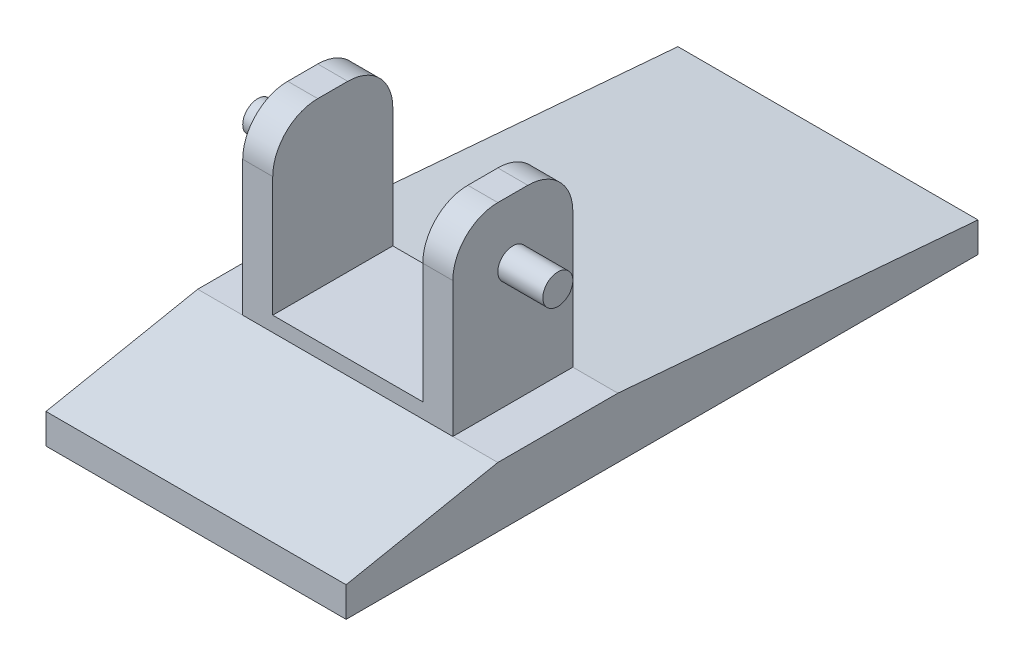
ISO-10303-21;
HEADER;
FILE_DESCRIPTION(('STEP AP214'),'2;1');
FILE_NAME('part.step','',(''),(''),'','','');
FILE_SCHEMA(('AUTOMOTIVE_DESIGN { 1 0 10303 214 1 1 1 1 }'));
ENDSEC;
DATA;
#1=APPLICATION_CONTEXT('core data for automotive mechanical design processes');
#2=APPLICATION_PROTOCOL_DEFINITION('international standard','automotive_design',2000,#1);
#3=PRODUCT_CONTEXT('',#1,'mechanical');
#4=PRODUCT('Part','Part','',(#3));
#5=PRODUCT_RELATED_PRODUCT_CATEGORY('part','',(#4));
#6=PRODUCT_DEFINITION_FORMATION('','',#4);
#7=PRODUCT_DEFINITION_CONTEXT('part definition',#1,'design');
#8=PRODUCT_DEFINITION('design','',#6,#7);
#9=PRODUCT_DEFINITION_SHAPE('','',#8);
#10=(LENGTH_UNIT() NAMED_UNIT(*) SI_UNIT(.MILLI.,.METRE.));
#11=(NAMED_UNIT(*) PLANE_ANGLE_UNIT() SI_UNIT($,.RADIAN.));
#12=(NAMED_UNIT(*) SI_UNIT($,.STERADIAN.) SOLID_ANGLE_UNIT());
#13=UNCERTAINTY_MEASURE_WITH_UNIT(LENGTH_MEASURE(1.E-05),#10,'distance_accuracy_value','');
#14=(GEOMETRIC_REPRESENTATION_CONTEXT(3) GLOBAL_UNCERTAINTY_ASSIGNED_CONTEXT((#13)) GLOBAL_UNIT_ASSIGNED_CONTEXT((#10,
#11,#12)) REPRESENTATION_CONTEXT('',''));
#15=CARTESIAN_POINT('',(0.,0.,0.));
#16=DIRECTION('',(0.,0.,1.));
#17=DIRECTION('',(1.,0.,0.));
#18=AXIS2_PLACEMENT_3D('',#15,#16,#17);
#19=CARTESIAN_POINT('',(10.,46.1253104324718,-4.99999999999999));
#20=DIRECTION('',(-1.,0.,0.));
#21=DIRECTION('',(0.,0.,1.));
#22=AXIS2_PLACEMENT_3D('',#19,#20,#21);
#23=PLANE('',#22);
#24=CARTESIAN_POINT('',(10.,41.1253104324718,0.));
#25=DIRECTION('',(-1.,0.,0.));
#26=DIRECTION('',(0.,0.,1.));
#27=AXIS2_PLACEMENT_3D('',#24,#25,#26);
#28=CIRCLE('',#27,5.);
#29=CARTESIAN_POINT('',(10.,41.1253104324718,5.));
#30=VERTEX_POINT('',#29);
#31=EDGE_CURVE('E11',#30,#30,#28,.F.);
#32=ORIENTED_EDGE('',*,*,#31,.F.);
#33=EDGE_LOOP('',(#32));
#34=FACE_BOUND('',#33,.T.);
#35=DIRECTION('',(0.,0.,1.));
#36=VECTOR('',#35,1.);
#37=CARTESIAN_POINT('',(10.,1.1253104324718,20.));
#38=LINE('',#37,#36);
#39=CARTESIAN_POINT('',(10.,1.1253104324718,-20.));
#40=VERTEX_POINT('',#39);
#41=CARTESIAN_POINT('',(10.,1.1253104324718,20.));
#42=VERTEX_POINT('',#41);
#43=EDGE_CURVE('E86',#40,#42,#38,.T.);
#44=ORIENTED_EDGE('',*,*,#43,.F.);
#45=DIRECTION('',(0.,1.,0.));
#46=VECTOR('',#45,1.);
#47=CARTESIAN_POINT('',(10.,46.1253104324718,-20.));
#48=LINE('',#47,#46);
#49=CARTESIAN_POINT('',(10.,46.1253104324718,-20.));
#50=VERTEX_POINT('',#49);
#51=EDGE_CURVE('E128',#40,#50,#48,.T.);
#52=ORIENTED_EDGE('',*,*,#51,.T.);
#53=CARTESIAN_POINT('',(10.,46.1253104324718,-4.99999999999999));
#54=DIRECTION('',(1.,0.,0.));
#55=DIRECTION('',(0.,0.,1.));
#56=AXIS2_PLACEMENT_3D('',#53,#54,#55);
#57=CIRCLE('',#56,15.);
#58=CARTESIAN_POINT('',(10.,61.1253104324718,-4.99999999999999));
#59=VERTEX_POINT('',#58);
#60=EDGE_CURVE('E101',#50,#59,#57,.T.);
#61=ORIENTED_EDGE('',*,*,#60,.T.);
#62=DIRECTION('',(0.,0.,1.));
#63=VECTOR('',#62,1.);
#64=CARTESIAN_POINT('',(10.,61.1253104324718,5.));
#65=LINE('',#64,#63);
#66=CARTESIAN_POINT('',(10.,61.1253104324718,5.));
#67=VERTEX_POINT('',#66);
#68=EDGE_CURVE('E96',#59,#67,#65,.T.);
#69=ORIENTED_EDGE('',*,*,#68,.T.);
#70=CARTESIAN_POINT('',(10.,46.1253104324718,5.));
#71=DIRECTION('',(1.,0.,0.));
#72=DIRECTION('',(0.,0.,-1.));
#73=AXIS2_PLACEMENT_3D('',#70,#71,#72);
#74=CIRCLE('',#73,15.);
#75=CARTESIAN_POINT('',(10.,46.1253104324718,20.));
#76=VERTEX_POINT('',#75);
#77=EDGE_CURVE('E99',#67,#76,#74,.T.);
#78=ORIENTED_EDGE('',*,*,#77,.T.);
#79=DIRECTION('',(0.,-1.,0.));
#80=VECTOR('',#79,1.);
#81=CARTESIAN_POINT('',(10.,46.1253104324718,20.));
#82=LINE('',#81,#80);
#83=EDGE_CURVE('E58',#76,#42,#82,.T.);
#84=ORIENTED_EDGE('',*,*,#83,.T.);
#85=EDGE_LOOP('',(#44,#52,#61,#69,#78,#84));
#86=FACE_BOUND('',#85,.T.);
#87=ADVANCED_FACE('F34',(#34,#86),#23,.F.);
#88=CARTESIAN_POINT('',(10.,-8.8746895675282,70.5497856889293));
#89=DIRECTION('',(0.,0.,-1.));
#90=DIRECTION('',(-1.,0.,0.));
#91=AXIS2_PLACEMENT_3D('',#88,#89,#90);
#92=PLANE('',#91);
#93=DIRECTION('',(-1.,0.,0.));
#94=VECTOR('',#93,1.);
#95=CARTESIAN_POINT('',(10.,-8.8746895675282,70.5497856889293));
#96=LINE('',#95,#94);
#97=CARTESIAN_POINT('',(25.,-8.8746895675282,70.5497856889293));
#98=VERTEX_POINT('',#97);
#99=CARTESIAN_POINT('',(-75.,-8.8746895675282,70.5497856889293));
#100=VERTEX_POINT('',#99);
#101=EDGE_CURVE('E115',#98,#100,#96,.T.);
#102=ORIENTED_EDGE('',*,*,#101,.T.);
#103=DIRECTION('',(0.,-1.,0.));
#104=VECTOR('',#103,1.);
#105=CARTESIAN_POINT('',(-75.,-18.8746895675282,70.5497856889293));
#106=LINE('',#105,#104);
#107=CARTESIAN_POINT('',(-75.,-18.8746895675282,70.5497856889293));
#108=VERTEX_POINT('',#107);
#109=EDGE_CURVE('E172',#100,#108,#106,.T.);
#110=ORIENTED_EDGE('',*,*,#109,.T.);
#111=DIRECTION('',(-1.,0.,0.));
#112=VECTOR('',#111,1.);
#113=CARTESIAN_POINT('',(10.,-18.8746895675282,70.5497856889293));
#114=LINE('',#113,#112);
#115=CARTESIAN_POINT('',(25.,-18.8746895675282,70.5497856889293));
#116=VERTEX_POINT('',#115);
#117=EDGE_CURVE('E42',#116,#108,#114,.T.);
#118=ORIENTED_EDGE('',*,*,#117,.F.);
#119=DIRECTION('',(0.,-1.,0.));
#120=VECTOR('',#119,1.);
#121=CARTESIAN_POINT('',(25.,-18.8746895675282,70.5497856889293));
#122=LINE('',#121,#120);
#123=EDGE_CURVE('E250',#98,#116,#122,.T.);
#124=ORIENTED_EDGE('',*,*,#123,.F.);
#125=EDGE_LOOP('',(#102,#110,#118,#124));
#126=FACE_BOUND('',#125,.T.);
#127=ADVANCED_FACE('F36',(#126),#92,.F.);
#128=CARTESIAN_POINT('',(10.,-18.8746895675282,70.5497856889293));
#129=DIRECTION('',(0.,1.,0.));
#130=DIRECTION('',(0.,0.,1.));
#131=AXIS2_PLACEMENT_3D('',#128,#129,#130);
#132=PLANE('',#131);
#133=ORIENTED_EDGE('',*,*,#117,.T.);
#134=DIRECTION('',(0.,0.,-1.));
#135=VECTOR('',#134,1.);
#136=CARTESIAN_POINT('',(-75.,-18.8746895675282,-140.));
#137=LINE('',#136,#135);
#138=CARTESIAN_POINT('',(-75.,-18.8746895675282,-140.));
#139=VERTEX_POINT('',#138);
#140=EDGE_CURVE('E157',#108,#139,#137,.T.);
#141=ORIENTED_EDGE('',*,*,#140,.T.);
#142=DIRECTION('',(-1.,0.,0.));
#143=VECTOR('',#142,1.);
#144=CARTESIAN_POINT('',(10.,-18.8746895675282,-140.));
#145=LINE('',#144,#143);
#146=CARTESIAN_POINT('',(25.,-18.8746895675282,-140.));
#147=VERTEX_POINT('',#146);
#148=EDGE_CURVE('E145',#147,#139,#145,.T.);
#149=ORIENTED_EDGE('',*,*,#148,.F.);
#150=DIRECTION('',(0.,0.,-1.));
#151=VECTOR('',#150,1.);
#152=CARTESIAN_POINT('',(25.,-18.8746895675282,-140.));
#153=LINE('',#152,#151);
#154=EDGE_CURVE('E160',#116,#147,#153,.T.);
#155=ORIENTED_EDGE('',*,*,#154,.F.);
#156=EDGE_LOOP('',(#133,#141,#149,#155));
#157=FACE_BOUND('',#156,.T.);
#158=ADVANCED_FACE('F154',(#157),#132,.F.);
#159=CARTESIAN_POINT('',(10.,-8.8746895675282,-140.));
#160=DIRECTION('',(0.,0.,1.));
#161=DIRECTION('',(1.,0.,0.));
#162=AXIS2_PLACEMENT_3D('',#159,#160,#161);
#163=PLANE('',#162);
#164=ORIENTED_EDGE('',*,*,#148,.T.);
#165=DIRECTION('',(0.,1.,0.));
#166=VECTOR('',#165,1.);
#167=CARTESIAN_POINT('',(-75.,-8.8746895675282,-140.));
#168=LINE('',#167,#166);
#169=CARTESIAN_POINT('',(-75.,-8.8746895675282,-140.));
#170=VERTEX_POINT('',#169);
#171=EDGE_CURVE('E175',#139,#170,#168,.T.);
#172=ORIENTED_EDGE('',*,*,#171,.T.);
#173=DIRECTION('',(-1.,0.,0.));
#174=VECTOR('',#173,1.);
#175=CARTESIAN_POINT('',(10.,-8.8746895675282,-140.));
#176=LINE('',#175,#174);
#177=CARTESIAN_POINT('',(25.,-8.8746895675282,-140.));
#178=VERTEX_POINT('',#177);
#179=EDGE_CURVE('E142',#178,#170,#176,.T.);
#180=ORIENTED_EDGE('',*,*,#179,.F.);
#181=DIRECTION('',(0.,1.,0.));
#182=VECTOR('',#181,1.);
#183=CARTESIAN_POINT('',(25.,-8.8746895675282,-140.));
#184=LINE('',#183,#182);
#185=EDGE_CURVE('E253',#147,#178,#184,.T.);
#186=ORIENTED_EDGE('',*,*,#185,.F.);
#187=EDGE_LOOP('',(#164,#172,#180,#186));
#188=FACE_BOUND('',#187,.T.);
#189=ADVANCED_FACE('F384',(#188),#163,.F.);
#190=CARTESIAN_POINT('',(10.,1.1253104324718,-20.));
#191=DIRECTION('',(0.,-0.99654575824488,0.08304547985374));
#192=DIRECTION('',(0.,-0.08304547985374,-0.99654575824488));
#193=AXIS2_PLACEMENT_3D('',#190,#191,#192);
#194=PLANE('',#193);
#195=ORIENTED_EDGE('',*,*,#179,.T.);
#196=DIRECTION('',(0.,0.08304547985374,0.99654575824488));
#197=VECTOR('',#196,1.);
#198=CARTESIAN_POINT('',(-75.,1.1253104324718,-20.));
#199=LINE('',#198,#197);
#200=CARTESIAN_POINT('',(-75.,1.1253104324718,-20.));
#201=VERTEX_POINT('',#200);
#202=EDGE_CURVE('E185',#170,#201,#199,.T.);
#203=ORIENTED_EDGE('',*,*,#202,.T.);
#204=DIRECTION('',(1.,0.,0.));
#205=VECTOR('',#204,1.);
#206=CARTESIAN_POINT('',(-75.,1.1253104324718,-20.));
#207=LINE('',#206,#205);
#208=CARTESIAN_POINT('',(-60.,1.1253104324718,-20.));
#209=VERTEX_POINT('',#208);
#210=EDGE_CURVE('E196',#201,#209,#207,.T.);
#211=ORIENTED_EDGE('',*,*,#210,.T.);
#212=DIRECTION('',(-1.,0.,0.));
#213=VECTOR('',#212,1.);
#214=CARTESIAN_POINT('',(10.,1.1253104324718,-20.));
#215=LINE('',#214,#213);
#216=EDGE_CURVE('E139',#40,#209,#215,.T.);
#217=ORIENTED_EDGE('',*,*,#216,.F.);
#218=DIRECTION('',(-1.,0.,0.));
#219=VECTOR('',#218,1.);
#220=CARTESIAN_POINT('',(25.,1.1253104324718,-20.));
#221=LINE('',#220,#219);
#222=CARTESIAN_POINT('',(25.,1.1253104324718,-20.));
#223=VERTEX_POINT('',#222);
#224=EDGE_CURVE('E269',#223,#40,#221,.T.);
#225=ORIENTED_EDGE('',*,*,#224,.F.);
#226=DIRECTION('',(0.,0.08304547985374,0.99654575824488));
#227=VECTOR('',#226,1.);
#228=CARTESIAN_POINT('',(25.,1.1253104324718,-20.));
#229=LINE('',#228,#227);
#230=EDGE_CURVE('E256',#178,#223,#229,.T.);
#231=ORIENTED_EDGE('',*,*,#230,.F.);
#232=EDGE_LOOP('',(#195,#203,#211,#217,#225,#231));
#233=FACE_BOUND('',#232,.T.);
#234=ADVANCED_FACE('F356',(#233),#194,.F.);
#235=CARTESIAN_POINT('',(10.,46.1253104324718,-20.));
#236=DIRECTION('',(0.,0.,1.));
#237=DIRECTION('',(1.,0.,0.));
#238=AXIS2_PLACEMENT_3D('',#235,#236,#237);
#239=PLANE('',#238);
#240=ORIENTED_EDGE('',*,*,#216,.T.);
#241=DIRECTION('',(0.,1.,0.));
#242=VECTOR('',#241,1.);
#243=CARTESIAN_POINT('',(-60.,46.1253104324718,-20.));
#244=LINE('',#243,#242);
#245=CARTESIAN_POINT('',(-60.,46.1253104324718,-20.));
#246=VERTEX_POINT('',#245);
#247=EDGE_CURVE('E206',#209,#246,#244,.T.);
#248=ORIENTED_EDGE('',*,*,#247,.T.);
#249=DIRECTION('',(1.,0.,0.));
#250=VECTOR('',#249,1.);
#251=CARTESIAN_POINT('',(-60.,46.1253104324718,-20.));
#252=LINE('',#251,#250);
#253=CARTESIAN_POINT('',(-50.,46.1253104324718,-20.));
#254=VERTEX_POINT('',#253);
#255=EDGE_CURVE('E244',#246,#254,#252,.T.);
#256=ORIENTED_EDGE('',*,*,#255,.T.);
#257=DIRECTION('',(0.,1.,0.));
#258=VECTOR('',#257,1.);
#259=CARTESIAN_POINT('',(-50.,46.1253104324718,-20.));
#260=LINE('',#259,#258);
#261=CARTESIAN_POINT('',(-50.,6.1253104324718,-20.));
#262=VERTEX_POINT('',#261);
#263=EDGE_CURVE('E205',#262,#254,#260,.T.);
#264=ORIENTED_EDGE('',*,*,#263,.F.);
#265=DIRECTION('',(1.,0.,0.));
#266=VECTOR('',#265,1.);
#267=CARTESIAN_POINT('',(-25.,6.1253104324718,-20.));
#268=LINE('',#267,#266);
#269=CARTESIAN_POINT('',(0.,6.1253104324718,-20.));
#270=VERTEX_POINT('',#269);
#271=EDGE_CURVE('E276',#262,#270,#268,.T.);
#272=ORIENTED_EDGE('',*,*,#271,.T.);
#273=DIRECTION('',(0.,1.,0.));
#274=VECTOR('',#273,1.);
#275=CARTESIAN_POINT('',(0.,46.1253104324718,-20.));
#276=LINE('',#275,#274);
#277=CARTESIAN_POINT('',(0.,46.1253104324718,-20.));
#278=VERTEX_POINT('',#277);
#279=EDGE_CURVE('E119',#270,#278,#276,.T.);
#280=ORIENTED_EDGE('',*,*,#279,.T.);
#281=DIRECTION('',(-1.,0.,0.));
#282=VECTOR('',#281,1.);
#283=CARTESIAN_POINT('',(10.,46.1253104324718,-20.));
#284=LINE('',#283,#282);
#285=EDGE_CURVE('E136',#50,#278,#284,.T.);
#286=ORIENTED_EDGE('',*,*,#285,.F.);
#287=ORIENTED_EDGE('',*,*,#51,.F.);
#288=EDGE_LOOP('',(#240,#248,#256,#264,#272,#280,#286,#287));
#289=FACE_BOUND('',#288,.T.);
#290=ADVANCED_FACE('F284',(#289),#239,.F.);
#291=CARTESIAN_POINT('',(10.,46.1253104324718,-4.99999999999999));
#292=DIRECTION('',(-1.,0.,0.));
#293=DIRECTION('',(0.,0.,1.));
#294=AXIS2_PLACEMENT_3D('',#291,#292,#293);
#295=CYLINDRICAL_SURFACE('',#294,15.);
#296=CARTESIAN_POINT('',(0.,46.1253104324718,-4.99999999999999));
#297=DIRECTION('',(1.,0.,0.));
#298=DIRECTION('',(0.,0.,1.));
#299=AXIS2_PLACEMENT_3D('',#296,#297,#298);
#300=CIRCLE('',#299,15.);
#301=CARTESIAN_POINT('',(0.,61.1253104324718,-4.99999999999999));
#302=VERTEX_POINT('',#301);
#303=EDGE_CURVE('E121',#278,#302,#300,.T.);
#304=ORIENTED_EDGE('',*,*,#303,.T.);
#305=DIRECTION('',(-1.,0.,0.));
#306=VECTOR('',#305,1.);
#307=CARTESIAN_POINT('',(10.,61.1253104324718,-4.99999999999999));
#308=LINE('',#307,#306);
#309=EDGE_CURVE('E110',#59,#302,#308,.T.);
#310=ORIENTED_EDGE('',*,*,#309,.F.);
#311=ORIENTED_EDGE('',*,*,#60,.F.);
#312=ORIENTED_EDGE('',*,*,#285,.T.);
#313=EDGE_LOOP('',(#304,#310,#311,#312));
#314=FACE_BOUND('',#313,.T.);
#315=ADVANCED_FACE('F287',(#314),#295,.T.);
#316=CARTESIAN_POINT('',(10.,61.1253104324718,5.));
#317=DIRECTION('',(0.,-1.,0.));
#318=DIRECTION('',(0.,0.,-1.));
#319=AXIS2_PLACEMENT_3D('',#316,#317,#318);
#320=PLANE('',#319);
#321=DIRECTION('',(0.,0.,1.));
#322=VECTOR('',#321,1.);
#323=CARTESIAN_POINT('',(0.,61.1253104324718,5.));
#324=LINE('',#323,#322);
#325=CARTESIAN_POINT('',(0.,61.1253104324718,5.));
#326=VERTEX_POINT('',#325);
#327=EDGE_CURVE('E109',#302,#326,#324,.T.);
#328=ORIENTED_EDGE('',*,*,#327,.T.);
#329=DIRECTION('',(-1.,0.,0.));
#330=VECTOR('',#329,1.);
#331=CARTESIAN_POINT('',(10.,61.1253104324718,5.));
#332=LINE('',#331,#330);
#333=EDGE_CURVE('E106',#67,#326,#332,.T.);
#334=ORIENTED_EDGE('',*,*,#333,.F.);
#335=ORIENTED_EDGE('',*,*,#68,.F.);
#336=ORIENTED_EDGE('',*,*,#309,.T.);
#337=EDGE_LOOP('',(#328,#334,#335,#336));
#338=FACE_BOUND('',#337,.T.);
#339=ADVANCED_FACE('F107',(#338),#320,.F.);
#340=CARTESIAN_POINT('',(10.,46.1253104324718,5.));
#341=DIRECTION('',(-1.,0.,0.));
#342=DIRECTION('',(0.,0.,1.));
#343=AXIS2_PLACEMENT_3D('',#340,#341,#342);
#344=CYLINDRICAL_SURFACE('',#343,15.);
#345=CARTESIAN_POINT('',(0.,46.1253104324718,5.));
#346=DIRECTION('',(1.,0.,0.));
#347=DIRECTION('',(0.,0.,-1.));
#348=AXIS2_PLACEMENT_3D('',#345,#346,#347);
#349=CIRCLE('',#348,15.);
#350=CARTESIAN_POINT('',(0.,46.1253104324718,20.));
#351=VERTEX_POINT('',#350);
#352=EDGE_CURVE('E80',#326,#351,#349,.T.);
#353=ORIENTED_EDGE('',*,*,#352,.T.);
#354=DIRECTION('',(-1.,0.,0.));
#355=VECTOR('',#354,1.);
#356=CARTESIAN_POINT('',(10.,46.1253104324718,20.));
#357=LINE('',#356,#355);
#358=EDGE_CURVE('E111',#76,#351,#357,.T.);
#359=ORIENTED_EDGE('',*,*,#358,.F.);
#360=ORIENTED_EDGE('',*,*,#77,.F.);
#361=ORIENTED_EDGE('',*,*,#333,.T.);
#362=EDGE_LOOP('',(#353,#359,#360,#361));
#363=FACE_BOUND('',#362,.T.);
#364=ADVANCED_FACE('F113',(#363),#344,.T.);
#365=CARTESIAN_POINT('',(10.,46.1253104324718,20.));
#366=DIRECTION('',(0.,0.,-1.));
#367=DIRECTION('',(0.,1.,0.));
#368=AXIS2_PLACEMENT_3D('',#365,#366,#367);
#369=PLANE('',#368);
#370=DIRECTION('',(0.,-1.,0.));
#371=VECTOR('',#370,1.);
#372=CARTESIAN_POINT('',(0.,46.1253104324718,20.));
#373=LINE('',#372,#371);
#374=CARTESIAN_POINT('',(0.,6.12531043247181,20.));
#375=VERTEX_POINT('',#374);
#376=EDGE_CURVE('E126',#351,#375,#373,.T.);
#377=ORIENTED_EDGE('',*,*,#376,.T.);
#378=DIRECTION('',(1.,0.,0.));
#379=VECTOR('',#378,1.);
#380=CARTESIAN_POINT('',(-25.,6.1253104324718,20.));
#381=LINE('',#380,#379);
#382=CARTESIAN_POINT('',(-50.,6.12531043247181,20.));
#383=VERTEX_POINT('',#382);
#384=EDGE_CURVE('E122',#383,#375,#381,.T.);
#385=ORIENTED_EDGE('',*,*,#384,.F.);
#386=DIRECTION('',(0.,-1.,0.));
#387=VECTOR('',#386,1.);
#388=CARTESIAN_POINT('',(-50.,46.1253104324718,20.));
#389=LINE('',#388,#387);
#390=CARTESIAN_POINT('',(-50.,46.1253104324718,20.));
#391=VERTEX_POINT('',#390);
#392=EDGE_CURVE('E210',#391,#383,#389,.T.);
#393=ORIENTED_EDGE('',*,*,#392,.F.);
#394=DIRECTION('',(1.,0.,0.));
#395=VECTOR('',#394,1.);
#396=CARTESIAN_POINT('',(-60.,46.1253104324718,20.));
#397=LINE('',#396,#395);
#398=CARTESIAN_POINT('',(-60.,46.1253104324718,20.));
#399=VERTEX_POINT('',#398);
#400=EDGE_CURVE('E222',#399,#391,#397,.T.);
#401=ORIENTED_EDGE('',*,*,#400,.F.);
#402=DIRECTION('',(0.,-1.,0.));
#403=VECTOR('',#402,1.);
#404=CARTESIAN_POINT('',(-60.,46.1253104324718,20.));
#405=LINE('',#404,#403);
#406=CARTESIAN_POINT('',(-60.,1.1253104324718,20.));
#407=VERTEX_POINT('',#406);
#408=EDGE_CURVE('E219',#399,#407,#405,.T.);
#409=ORIENTED_EDGE('',*,*,#408,.T.);
#410=DIRECTION('',(-1.,0.,0.));
#411=VECTOR('',#410,1.);
#412=CARTESIAN_POINT('',(10.,1.1253104324718,20.));
#413=LINE('',#412,#411);
#414=EDGE_CURVE('E131',#42,#407,#413,.T.);
#415=ORIENTED_EDGE('',*,*,#414,.F.);
#416=ORIENTED_EDGE('',*,*,#83,.F.);
#417=ORIENTED_EDGE('',*,*,#358,.T.);
#418=EDGE_LOOP('',(#377,#385,#393,#401,#409,#415,#416,#417));
#419=FACE_BOUND('',#418,.T.);
#420=ADVANCED_FACE('F291',(#419),#369,.F.);
#421=CARTESIAN_POINT('',(10.,1.1253104324718,20.));
#422=DIRECTION('',(0.,-0.980988888903293,-0.194063906608834));
#423=DIRECTION('',(0.,0.194063906608834,-0.980988888903293));
#424=AXIS2_PLACEMENT_3D('',#421,#422,#423);
#425=PLANE('',#424);
#426=ORIENTED_EDGE('',*,*,#414,.T.);
#427=DIRECTION('',(1.,0.,0.));
#428=VECTOR('',#427,1.);
#429=CARTESIAN_POINT('',(-75.,1.1253104324718,20.));
#430=LINE('',#429,#428);
#431=CARTESIAN_POINT('',(-75.,1.1253104324718,20.));
#432=VERTEX_POINT('',#431);
#433=EDGE_CURVE('E192',#432,#407,#430,.T.);
#434=ORIENTED_EDGE('',*,*,#433,.F.);
#435=DIRECTION('',(0.,-0.194063906608834,0.980988888903293));
#436=VECTOR('',#435,1.);
#437=CARTESIAN_POINT('',(-75.,-8.8746895675282,70.5497856889293));
#438=LINE('',#437,#436);
#439=EDGE_CURVE('E191',#432,#100,#438,.T.);
#440=ORIENTED_EDGE('',*,*,#439,.T.);
#441=ORIENTED_EDGE('',*,*,#101,.F.);
#442=DIRECTION('',(0.,-0.194063906608834,0.980988888903293));
#443=VECTOR('',#442,1.);
#444=CARTESIAN_POINT('',(25.,-8.8746895675282,70.5497856889293));
#445=LINE('',#444,#443);
#446=CARTESIAN_POINT('',(25.,1.1253104324718,20.));
#447=VERTEX_POINT('',#446);
#448=EDGE_CURVE('E262',#447,#98,#445,.T.);
#449=ORIENTED_EDGE('',*,*,#448,.F.);
#450=DIRECTION('',(-1.,0.,0.));
#451=VECTOR('',#450,1.);
#452=CARTESIAN_POINT('',(25.,1.1253104324718,20.));
#453=LINE('',#452,#451);
#454=EDGE_CURVE('E265',#447,#42,#453,.T.);
#455=ORIENTED_EDGE('',*,*,#454,.T.);
#456=EDGE_LOOP('',(#426,#434,#440,#441,#449,#455));
#457=FACE_BOUND('',#456,.T.);
#458=ADVANCED_FACE('F346',(#457),#425,.F.);
#459=CARTESIAN_POINT('',(0.,46.1253104324718,-4.99999999999999));
#460=DIRECTION('',(-1.,0.,0.));
#461=DIRECTION('',(0.,0.,1.));
#462=AXIS2_PLACEMENT_3D('',#459,#460,#461);
#463=PLANE('',#462);
#464=DIRECTION('',(0.,0.,-1.));
#465=VECTOR('',#464,1.);
#466=CARTESIAN_POINT('',(0.,6.1253104324718,-20.));
#467=LINE('',#466,#465);
#468=EDGE_CURVE('E49',#375,#270,#467,.T.);
#469=ORIENTED_EDGE('',*,*,#468,.F.);
#470=ORIENTED_EDGE('',*,*,#376,.F.);
#471=ORIENTED_EDGE('',*,*,#352,.F.);
#472=ORIENTED_EDGE('',*,*,#327,.F.);
#473=ORIENTED_EDGE('',*,*,#303,.F.);
#474=ORIENTED_EDGE('',*,*,#279,.F.);
#475=EDGE_LOOP('',(#469,#470,#471,#472,#473,#474));
#476=FACE_BOUND('',#475,.T.);
#477=ADVANCED_FACE('F288',(#476),#463,.T.);
#478=CARTESIAN_POINT('',(-25.,6.1253104324718,-20.));
#479=DIRECTION('',(0.,-1.,0.));
#480=DIRECTION('',(0.,0.,-1.));
#481=AXIS2_PLACEMENT_3D('',#478,#479,#480);
#482=PLANE('',#481);
#483=ORIENTED_EDGE('',*,*,#468,.T.);
#484=ORIENTED_EDGE('',*,*,#271,.F.);
#485=DIRECTION('',(0.,0.,-1.));
#486=VECTOR('',#485,1.);
#487=CARTESIAN_POINT('',(-50.,6.1253104324718,-20.));
#488=LINE('',#487,#486);
#489=EDGE_CURVE('E202',#383,#262,#488,.T.);
#490=ORIENTED_EDGE('',*,*,#489,.F.);
#491=ORIENTED_EDGE('',*,*,#384,.T.);
#492=EDGE_LOOP('',(#483,#484,#490,#491));
#493=FACE_BOUND('',#492,.T.);
#494=ADVANCED_FACE('F296',(#493),#482,.F.);
#495=CARTESIAN_POINT('',(25.,41.1253104324718,0.));
#496=DIRECTION('',(-1.,0.,0.));
#497=DIRECTION('',(0.,0.,1.));
#498=AXIS2_PLACEMENT_3D('',#495,#496,#497);
#499=CYLINDRICAL_SURFACE('',#498,5.);
#500=CARTESIAN_POINT('',(25.,41.1253104324718,0.));
#501=DIRECTION('',(1.,0.,0.));
#502=DIRECTION('',(0.,0.,-1.));
#503=AXIS2_PLACEMENT_3D('',#500,#501,#502);
#504=CIRCLE('',#503,5.);
#505=CARTESIAN_POINT('',(25.,41.1253104324718,-5.));
#506=VERTEX_POINT('',#505);
#507=EDGE_CURVE('E272',#506,#506,#504,.T.);
#508=ORIENTED_EDGE('',*,*,#507,.F.);
#509=EDGE_LOOP('',(#508));
#510=FACE_BOUND('',#509,.T.);
#511=ORIENTED_EDGE('',*,*,#31,.T.);
#512=EDGE_LOOP('',(#511));
#513=FACE_BOUND('',#512,.T.);
#514=ADVANCED_FACE('F450',(#510,#513),#499,.T.);
#515=CARTESIAN_POINT('',(25.,41.1253104324718,0.));
#516=DIRECTION('',(1.,0.,0.));
#517=DIRECTION('',(0.,0.,-1.));
#518=AXIS2_PLACEMENT_3D('',#515,#516,#517);
#519=PLANE('',#518);
#520=ORIENTED_EDGE('',*,*,#507,.T.);
#521=EDGE_LOOP('',(#520));
#522=FACE_BOUND('',#521,.T.);
#523=ADVANCED_FACE('F456',(#522),#519,.T.);
#524=CARTESIAN_POINT('',(25.,1.1253104324718,20.));
#525=DIRECTION('',(0.,-1.,0.));
#526=DIRECTION('',(0.,0.,-1.));
#527=AXIS2_PLACEMENT_3D('',#524,#525,#526);
#528=PLANE('',#527);
#529=ORIENTED_EDGE('',*,*,#43,.T.);
#530=ORIENTED_EDGE('',*,*,#454,.F.);
#531=DIRECTION('',(0.,0.,1.));
#532=VECTOR('',#531,1.);
#533=CARTESIAN_POINT('',(25.,1.1253104324718,20.));
#534=LINE('',#533,#532);
#535=EDGE_CURVE('E259',#223,#447,#534,.T.);
#536=ORIENTED_EDGE('',*,*,#535,.F.);
#537=ORIENTED_EDGE('',*,*,#224,.T.);
#538=EDGE_LOOP('',(#529,#530,#536,#537));
#539=FACE_BOUND('',#538,.T.);
#540=ADVANCED_FACE('F354',(#539),#528,.F.);
#541=CARTESIAN_POINT('',(25.,0.,0.));
#542=DIRECTION('',(-1.,0.,0.));
#543=DIRECTION('',(0.,0.,1.));
#544=AXIS2_PLACEMENT_3D('',#541,#542,#543);
#545=PLANE('',#544);
#546=ORIENTED_EDGE('',*,*,#123,.T.);
#547=ORIENTED_EDGE('',*,*,#154,.T.);
#548=ORIENTED_EDGE('',*,*,#185,.T.);
#549=ORIENTED_EDGE('',*,*,#230,.T.);
#550=ORIENTED_EDGE('',*,*,#535,.T.);
#551=ORIENTED_EDGE('',*,*,#448,.T.);
#552=EDGE_LOOP('',(#546,#547,#548,#549,#550,#551));
#553=FACE_BOUND('',#552,.T.);
#554=ADVANCED_FACE('F348',(#553),#545,.F.);
#555=CARTESIAN_POINT('',(-60.,46.1253104324718,-4.99999999999999));
#556=DIRECTION('',(1.,0.,0.));
#557=DIRECTION('',(0.,0.,1.));
#558=AXIS2_PLACEMENT_3D('',#555,#556,#557);
#559=PLANE('',#558);
#560=CARTESIAN_POINT('',(-60.,41.1253104324718,0.));
#561=DIRECTION('',(-1.,0.,0.));
#562=DIRECTION('',(0.,0.,1.));
#563=AXIS2_PLACEMENT_3D('',#560,#561,#562);
#564=CIRCLE('',#563,5.);
#565=CARTESIAN_POINT('',(-60.,41.1253104324718,5.));
#566=VERTEX_POINT('',#565);
#567=EDGE_CURVE('E247',#566,#566,#564,.F.);
#568=ORIENTED_EDGE('',*,*,#567,.T.);
#569=EDGE_LOOP('',(#568));
#570=FACE_BOUND('',#569,.T.);
#571=DIRECTION('',(0.,0.,1.));
#572=VECTOR('',#571,1.);
#573=CARTESIAN_POINT('',(-60.,1.1253104324718,20.));
#574=LINE('',#573,#572);
#575=EDGE_CURVE('E179',#209,#407,#574,.T.);
#576=ORIENTED_EDGE('',*,*,#575,.T.);
#577=ORIENTED_EDGE('',*,*,#408,.F.);
#578=CARTESIAN_POINT('',(-60.,46.1253104324718,5.));
#579=DIRECTION('',(1.,0.,0.));
#580=DIRECTION('',(0.,0.,-1.));
#581=AXIS2_PLACEMENT_3D('',#578,#579,#580);
#582=CIRCLE('',#581,15.);
#583=CARTESIAN_POINT('',(-60.,61.1253104324718,5.));
#584=VERTEX_POINT('',#583);
#585=EDGE_CURVE('E216',#584,#399,#582,.T.);
#586=ORIENTED_EDGE('',*,*,#585,.F.);
#587=DIRECTION('',(0.,0.,1.));
#588=VECTOR('',#587,1.);
#589=CARTESIAN_POINT('',(-60.,61.1253104324718,5.));
#590=LINE('',#589,#588);
#591=CARTESIAN_POINT('',(-60.,61.1253104324718,-4.99999999999999));
#592=VERTEX_POINT('',#591);
#593=EDGE_CURVE('E213',#592,#584,#590,.T.);
#594=ORIENTED_EDGE('',*,*,#593,.F.);
#595=CARTESIAN_POINT('',(-60.,46.1253104324718,-4.99999999999999));
#596=DIRECTION('',(1.,0.,0.));
#597=DIRECTION('',(0.,0.,1.));
#598=AXIS2_PLACEMENT_3D('',#595,#596,#597);
#599=CIRCLE('',#598,15.);
#600=EDGE_CURVE('E209',#246,#592,#599,.T.);
#601=ORIENTED_EDGE('',*,*,#600,.F.);
#602=ORIENTED_EDGE('',*,*,#247,.F.);
#603=EDGE_LOOP('',(#576,#577,#586,#594,#601,#602));
#604=FACE_BOUND('',#603,.T.);
#605=ADVANCED_FACE('F320',(#570,#604),#559,.F.);
#606=CARTESIAN_POINT('',(-60.,46.1253104324718,-4.99999999999999));
#607=DIRECTION('',(1.,0.,0.));
#608=DIRECTION('',(0.,0.,1.));
#609=AXIS2_PLACEMENT_3D('',#606,#607,#608);
#610=CYLINDRICAL_SURFACE('',#609,15.);
#611=CARTESIAN_POINT('',(-50.,46.1253104324718,-4.99999999999999));
#612=DIRECTION('',(1.,0.,0.));
#613=DIRECTION('',(0.,0.,1.));
#614=AXIS2_PLACEMENT_3D('',#611,#612,#613);
#615=CIRCLE('',#614,15.);
#616=CARTESIAN_POINT('',(-50.,61.1253104324718,-4.99999999999999));
#617=VERTEX_POINT('',#616);
#618=EDGE_CURVE('E225',#254,#617,#615,.T.);
#619=ORIENTED_EDGE('',*,*,#618,.F.);
#620=ORIENTED_EDGE('',*,*,#255,.F.);
#621=ORIENTED_EDGE('',*,*,#600,.T.);
#622=DIRECTION('',(1.,0.,0.));
#623=VECTOR('',#622,1.);
#624=CARTESIAN_POINT('',(-60.,61.1253104324718,-4.99999999999999));
#625=LINE('',#624,#623);
#626=EDGE_CURVE('E241',#592,#617,#625,.T.);
#627=ORIENTED_EDGE('',*,*,#626,.T.);
#628=EDGE_LOOP('',(#619,#620,#621,#627));
#629=FACE_BOUND('',#628,.T.);
#630=ADVANCED_FACE('F371',(#629),#610,.T.);
#631=CARTESIAN_POINT('',(-60.,61.1253104324718,5.));
#632=DIRECTION('',(0.,-1.,0.));
#633=DIRECTION('',(0.,0.,-1.));
#634=AXIS2_PLACEMENT_3D('',#631,#632,#633);
#635=PLANE('',#634);
#636=DIRECTION('',(0.,0.,1.));
#637=VECTOR('',#636,1.);
#638=CARTESIAN_POINT('',(-50.,61.1253104324718,5.));
#639=LINE('',#638,#637);
#640=CARTESIAN_POINT('',(-50.,61.1253104324718,5.));
#641=VERTEX_POINT('',#640);
#642=EDGE_CURVE('E228',#617,#641,#639,.T.);
#643=ORIENTED_EDGE('',*,*,#642,.F.);
#644=ORIENTED_EDGE('',*,*,#626,.F.);
#645=ORIENTED_EDGE('',*,*,#593,.T.);
#646=DIRECTION('',(1.,0.,0.));
#647=VECTOR('',#646,1.);
#648=CARTESIAN_POINT('',(-60.,61.1253104324718,5.));
#649=LINE('',#648,#647);
#650=EDGE_CURVE('E238',#584,#641,#649,.T.);
#651=ORIENTED_EDGE('',*,*,#650,.T.);
#652=EDGE_LOOP('',(#643,#644,#645,#651));
#653=FACE_BOUND('',#652,.T.);
#654=ADVANCED_FACE('F369',(#653),#635,.F.);
#655=CARTESIAN_POINT('',(-60.,46.1253104324718,5.));
#656=DIRECTION('',(1.,0.,0.));
#657=DIRECTION('',(0.,0.,1.));
#658=AXIS2_PLACEMENT_3D('',#655,#656,#657);
#659=CYLINDRICAL_SURFACE('',#658,15.);
#660=CARTESIAN_POINT('',(-50.,46.1253104324718,5.));
#661=DIRECTION('',(1.,0.,0.));
#662=DIRECTION('',(0.,0.,-1.));
#663=AXIS2_PLACEMENT_3D('',#660,#661,#662);
#664=CIRCLE('',#663,15.);
#665=EDGE_CURVE('E231',#641,#391,#664,.T.);
#666=ORIENTED_EDGE('',*,*,#665,.F.);
#667=ORIENTED_EDGE('',*,*,#650,.F.);
#668=ORIENTED_EDGE('',*,*,#585,.T.);
#669=ORIENTED_EDGE('',*,*,#400,.T.);
#670=EDGE_LOOP('',(#666,#667,#668,#669));
#671=FACE_BOUND('',#670,.T.);
#672=ADVANCED_FACE('F312',(#671),#659,.T.);
#673=CARTESIAN_POINT('',(-50.,46.1253104324718,-4.99999999999999));
#674=DIRECTION('',(1.,0.,0.));
#675=DIRECTION('',(0.,0.,1.));
#676=AXIS2_PLACEMENT_3D('',#673,#674,#675);
#677=PLANE('',#676);
#678=ORIENTED_EDGE('',*,*,#489,.T.);
#679=ORIENTED_EDGE('',*,*,#263,.T.);
#680=ORIENTED_EDGE('',*,*,#618,.T.);
#681=ORIENTED_EDGE('',*,*,#642,.T.);
#682=ORIENTED_EDGE('',*,*,#665,.T.);
#683=ORIENTED_EDGE('',*,*,#392,.T.);
#684=EDGE_LOOP('',(#678,#679,#680,#681,#682,#683));
#685=FACE_BOUND('',#684,.T.);
#686=ADVANCED_FACE('F303',(#685),#677,.T.);
#687=CARTESIAN_POINT('',(-75.,41.1253104324718,0.));
#688=DIRECTION('',(1.,0.,0.));
#689=DIRECTION('',(0.,0.,1.));
#690=AXIS2_PLACEMENT_3D('',#687,#688,#689);
#691=CYLINDRICAL_SURFACE('',#690,5.);
#692=CARTESIAN_POINT('',(-75.,41.1253104324718,0.));
#693=DIRECTION('',(1.,0.,0.));
#694=DIRECTION('',(0.,0.,-1.));
#695=AXIS2_PLACEMENT_3D('',#692,#693,#694);
#696=CIRCLE('',#695,5.);
#697=CARTESIAN_POINT('',(-75.,41.1253104324718,-5.));
#698=VERTEX_POINT('',#697);
#699=EDGE_CURVE('E199',#698,#698,#696,.T.);
#700=ORIENTED_EDGE('',*,*,#699,.T.);
#701=EDGE_LOOP('',(#700));
#702=FACE_BOUND('',#701,.T.);
#703=ORIENTED_EDGE('',*,*,#567,.F.);
#704=EDGE_LOOP('',(#703));
#705=FACE_BOUND('',#704,.T.);
#706=ADVANCED_FACE('F507',(#702,#705),#691,.T.);
#707=CARTESIAN_POINT('',(-75.,41.1253104324718,0.));
#708=DIRECTION('',(-1.,0.,0.));
#709=DIRECTION('',(0.,0.,-1.));
#710=AXIS2_PLACEMENT_3D('',#707,#708,#709);
#711=PLANE('',#710);
#712=ORIENTED_EDGE('',*,*,#699,.F.);
#713=EDGE_LOOP('',(#712));
#714=FACE_BOUND('',#713,.T.);
#715=ADVANCED_FACE('F514',(#714),#711,.T.);
#716=CARTESIAN_POINT('',(-75.,1.1253104324718,20.));
#717=DIRECTION('',(0.,-1.,0.));
#718=DIRECTION('',(0.,0.,-1.));
#719=AXIS2_PLACEMENT_3D('',#716,#717,#718);
#720=PLANE('',#719);
#721=ORIENTED_EDGE('',*,*,#575,.F.);
#722=ORIENTED_EDGE('',*,*,#210,.F.);
#723=DIRECTION('',(0.,0.,1.));
#724=VECTOR('',#723,1.);
#725=CARTESIAN_POINT('',(-75.,1.1253104324718,20.));
#726=LINE('',#725,#724);
#727=EDGE_CURVE('E188',#201,#432,#726,.T.);
#728=ORIENTED_EDGE('',*,*,#727,.T.);
#729=ORIENTED_EDGE('',*,*,#433,.T.);
#730=EDGE_LOOP('',(#721,#722,#728,#729));
#731=FACE_BOUND('',#730,.T.);
#732=ADVANCED_FACE('F373',(#731),#720,.F.);
#733=CARTESIAN_POINT('',(-75.,0.,0.));
#734=DIRECTION('',(1.,0.,0.));
#735=DIRECTION('',(0.,0.,1.));
#736=AXIS2_PLACEMENT_3D('',#733,#734,#735);
#737=PLANE('',#736);
#738=ORIENTED_EDGE('',*,*,#109,.F.);
#739=ORIENTED_EDGE('',*,*,#439,.F.);
#740=ORIENTED_EDGE('',*,*,#727,.F.);
#741=ORIENTED_EDGE('',*,*,#202,.F.);
#742=ORIENTED_EDGE('',*,*,#171,.F.);
#743=ORIENTED_EDGE('',*,*,#140,.F.);
#744=EDGE_LOOP('',(#738,#739,#740,#741,#742,#743));
#745=FACE_BOUND('',#744,.T.);
#746=ADVANCED_FACE('F169',(#745),#737,.F.);
#747=CLOSED_SHELL('',(#87,#127,#158,#189,#234,#290,#315,#339,#364,#420,#458,#477,#494,#514,#523,
#540,#554,#605,#630,#654,#672,#686,#706,#715,#732,#746));
#748=MANIFOLD_SOLID_BREP('B2',#747);
#749=ADVANCED_BREP_SHAPE_REPRESENTATION('',(#18,#748),#14);
#750=SHAPE_DEFINITION_REPRESENTATION(#9,#749);
ENDSEC;
END-ISO-10303-21;
